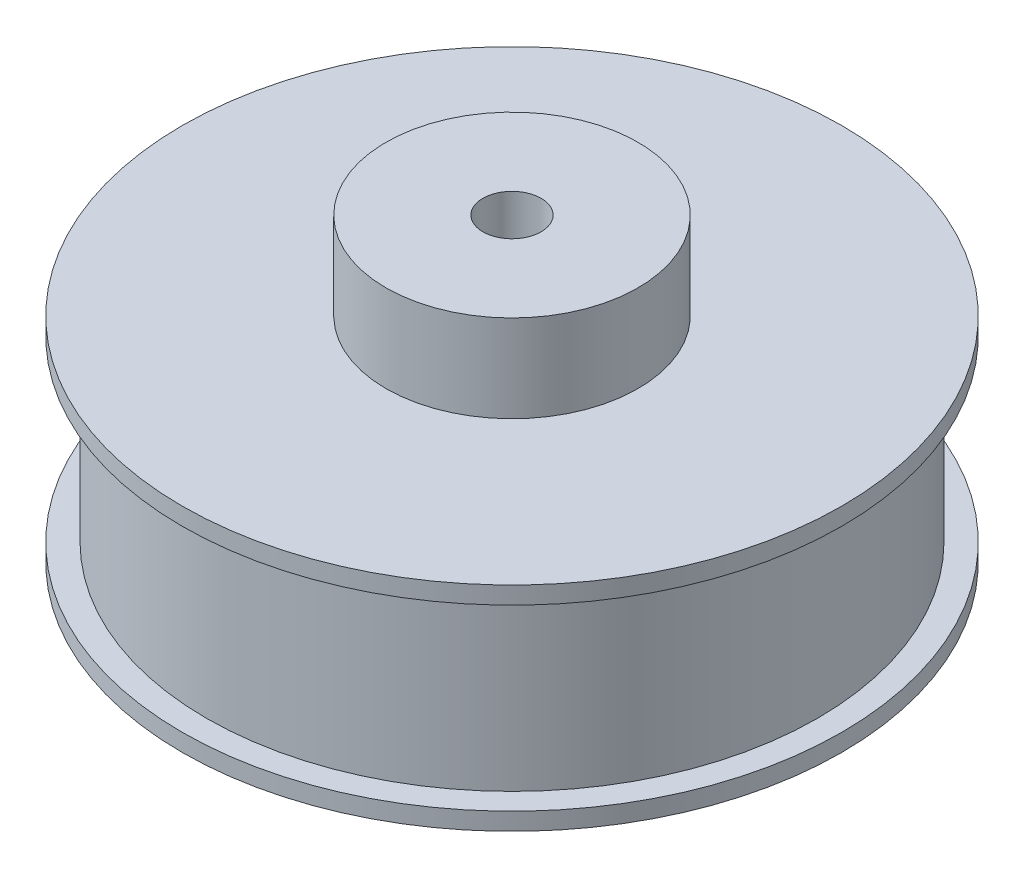
ISO-10303-21;
HEADER;
FILE_DESCRIPTION(('STEP AP214'),'2;1');
FILE_NAME('part.step','',(''),(''),'','','');
FILE_SCHEMA(('AUTOMOTIVE_DESIGN { 1 0 10303 214 1 1 1 1 }'));
ENDSEC;
DATA;
#1=APPLICATION_CONTEXT('core data for automotive mechanical design processes');
#2=APPLICATION_PROTOCOL_DEFINITION('international standard','automotive_design',2000,#1);
#3=PRODUCT_CONTEXT('',#1,'mechanical');
#4=PRODUCT('Part','Part','',(#3));
#5=PRODUCT_RELATED_PRODUCT_CATEGORY('part','',(#4));
#6=PRODUCT_DEFINITION_FORMATION('','',#4);
#7=PRODUCT_DEFINITION_CONTEXT('part definition',#1,'design');
#8=PRODUCT_DEFINITION('design','',#6,#7);
#9=PRODUCT_DEFINITION_SHAPE('','',#8);
#10=(LENGTH_UNIT() NAMED_UNIT(*) SI_UNIT(.MILLI.,.METRE.));
#11=(NAMED_UNIT(*) PLANE_ANGLE_UNIT() SI_UNIT($,.RADIAN.));
#12=(NAMED_UNIT(*) SI_UNIT($,.STERADIAN.) SOLID_ANGLE_UNIT());
#13=UNCERTAINTY_MEASURE_WITH_UNIT(LENGTH_MEASURE(1.E-05),#10,'distance_accuracy_value','');
#14=(GEOMETRIC_REPRESENTATION_CONTEXT(3) GLOBAL_UNCERTAINTY_ASSIGNED_CONTEXT((#13)) GLOBAL_UNIT_ASSIGNED_CONTEXT((#10,
#11,#12)) REPRESENTATION_CONTEXT('',''));
#15=CARTESIAN_POINT('',(0.,0.,0.));
#16=DIRECTION('',(0.,0.,1.));
#17=DIRECTION('',(1.,0.,0.));
#18=AXIS2_PLACEMENT_3D('',#15,#16,#17);
#19=CARTESIAN_POINT('',(0.,51.1748241374195,0.));
#20=DIRECTION('',(0.,1.,0.));
#21=DIRECTION('',(0.,0.,1.));
#22=AXIS2_PLACEMENT_3D('',#19,#20,#21);
#23=CYLINDRICAL_SURFACE('',#22,3.);
#24=CARTESIAN_POINT('',(0.,0.,0.));
#25=DIRECTION('',(0.,1.,0.));
#26=DIRECTION('',(0.,0.,1.));
#27=AXIS2_PLACEMENT_3D('',#24,#25,#26);
#28=CIRCLE('',#27,3.);
#29=CARTESIAN_POINT('',(0.,0.,3.));
#30=VERTEX_POINT('',#29);
#31=EDGE_CURVE('E67',#30,#30,#28,.T.);
#32=ORIENTED_EDGE('',*,*,#31,.F.);
#33=EDGE_LOOP('',(#32));
#34=FACE_BOUND('',#33,.T.);
#35=CARTESIAN_POINT('',(0.,31.,0.));
#36=DIRECTION('',(0.,1.,0.));
#37=DIRECTION('',(0.,0.,1.));
#38=AXIS2_PLACEMENT_3D('',#35,#36,#37);
#39=CIRCLE('',#38,3.00000000000001);
#40=CARTESIAN_POINT('',(0.,31.,3.00000000000001));
#41=VERTEX_POINT('',#40);
#42=EDGE_CURVE('E10',#41,#41,#39,.T.);
#43=ORIENTED_EDGE('',*,*,#42,.T.);
#44=EDGE_LOOP('',(#43));
#45=FACE_BOUND('',#44,.T.);
#46=ADVANCED_FACE('F33',(#34,#45),#23,.F.);
#47=CARTESIAN_POINT('',(3.00000000000001,31.,0.));
#48=DIRECTION('',(0.,-1.,0.));
#49=DIRECTION('',(0.,0.,-1.));
#50=AXIS2_PLACEMENT_3D('',#47,#48,#49);
#51=PLANE('',#50);
#52=ORIENTED_EDGE('',*,*,#42,.F.);
#53=EDGE_LOOP('',(#52));
#54=FACE_BOUND('',#53,.T.);
#55=CARTESIAN_POINT('',(0.,31.,0.));
#56=DIRECTION('',(0.,1.,0.));
#57=DIRECTION('',(0.,0.,1.));
#58=AXIS2_PLACEMENT_3D('',#55,#56,#57);
#59=CIRCLE('',#58,13.);
#60=CARTESIAN_POINT('',(0.,31.,13.));
#61=VERTEX_POINT('',#60);
#62=EDGE_CURVE('E39',#61,#61,#59,.T.);
#63=ORIENTED_EDGE('',*,*,#62,.T.);
#64=EDGE_LOOP('',(#63));
#65=FACE_BOUND('',#64,.T.);
#66=ADVANCED_FACE('F74',(#54,#65),#51,.F.);
#67=CARTESIAN_POINT('',(0.,51.1748241374195,0.));
#68=DIRECTION('',(0.,1.,0.));
#69=DIRECTION('',(0.,0.,1.));
#70=AXIS2_PLACEMENT_3D('',#67,#68,#69);
#71=CYLINDRICAL_SURFACE('',#70,13.);
#72=ORIENTED_EDGE('',*,*,#62,.F.);
#73=EDGE_LOOP('',(#72));
#74=FACE_BOUND('',#73,.T.);
#75=CARTESIAN_POINT('',(0.,22.,0.));
#76=DIRECTION('',(0.,1.,0.));
#77=DIRECTION('',(0.,0.,1.));
#78=AXIS2_PLACEMENT_3D('',#75,#76,#77);
#79=CIRCLE('',#78,13.);
#80=CARTESIAN_POINT('',(0.,22.,13.));
#81=VERTEX_POINT('',#80);
#82=EDGE_CURVE('E43',#81,#81,#79,.T.);
#83=ORIENTED_EDGE('',*,*,#82,.T.);
#84=EDGE_LOOP('',(#83));
#85=FACE_BOUND('',#84,.T.);
#86=ADVANCED_FACE('F78',(#74,#85),#71,.T.);
#87=CARTESIAN_POINT('',(13.,22.,0.));
#88=DIRECTION('',(0.,-1.,0.));
#89=DIRECTION('',(0.,0.,-1.));
#90=AXIS2_PLACEMENT_3D('',#87,#88,#89);
#91=PLANE('',#90);
#92=ORIENTED_EDGE('',*,*,#82,.F.);
#93=EDGE_LOOP('',(#92));
#94=FACE_BOUND('',#93,.T.);
#95=CARTESIAN_POINT('',(0.,22.,0.));
#96=DIRECTION('',(0.,1.,0.));
#97=DIRECTION('',(0.,0.,1.));
#98=AXIS2_PLACEMENT_3D('',#95,#96,#97);
#99=CIRCLE('',#98,34.);
#100=CARTESIAN_POINT('',(0.,22.,34.));
#101=VERTEX_POINT('',#100);
#102=EDGE_CURVE('E47',#101,#101,#99,.T.);
#103=ORIENTED_EDGE('',*,*,#102,.T.);
#104=EDGE_LOOP('',(#103));
#105=FACE_BOUND('',#104,.T.);
#106=ADVANCED_FACE('F83',(#94,#105),#91,.F.);
#107=CARTESIAN_POINT('',(0.,51.1748241374195,0.));
#108=DIRECTION('',(0.,1.,0.));
#109=DIRECTION('',(0.,0.,1.));
#110=AXIS2_PLACEMENT_3D('',#107,#108,#109);
#111=CYLINDRICAL_SURFACE('',#110,34.);
#112=ORIENTED_EDGE('',*,*,#102,.F.);
#113=EDGE_LOOP('',(#112));
#114=FACE_BOUND('',#113,.T.);
#115=CARTESIAN_POINT('',(0.,20.2,0.));
#116=DIRECTION('',(0.,1.,0.));
#117=DIRECTION('',(0.,0.,1.));
#118=AXIS2_PLACEMENT_3D('',#115,#116,#117);
#119=CIRCLE('',#118,34.);
#120=CARTESIAN_POINT('',(0.,20.2,34.));
#121=VERTEX_POINT('',#120);
#122=EDGE_CURVE('E52',#121,#121,#119,.T.);
#123=ORIENTED_EDGE('',*,*,#122,.T.);
#124=EDGE_LOOP('',(#123));
#125=FACE_BOUND('',#124,.T.);
#126=ADVANCED_FACE('F89',(#114,#125),#111,.T.);
#127=CARTESIAN_POINT('',(34.,20.2,0.));
#128=DIRECTION('',(0.,1.,0.));
#129=DIRECTION('',(0.,0.,1.));
#130=AXIS2_PLACEMENT_3D('',#127,#128,#129);
#131=PLANE('',#130);
#132=ORIENTED_EDGE('',*,*,#122,.F.);
#133=EDGE_LOOP('',(#132));
#134=FACE_BOUND('',#133,.T.);
#135=CARTESIAN_POINT('',(0.,20.2,0.));
#136=DIRECTION('',(0.,1.,0.));
#137=DIRECTION('',(0.,0.,1.));
#138=AXIS2_PLACEMENT_3D('',#135,#136,#137);
#139=CIRCLE('',#138,31.5);
#140=CARTESIAN_POINT('',(0.,20.2,31.5));
#141=VERTEX_POINT('',#140);
#142=EDGE_CURVE('E55',#141,#141,#139,.T.);
#143=ORIENTED_EDGE('',*,*,#142,.T.);
#144=EDGE_LOOP('',(#143));
#145=FACE_BOUND('',#144,.T.);
#146=ADVANCED_FACE('F93',(#134,#145),#131,.F.);
#147=CARTESIAN_POINT('',(0.,51.1748241374195,0.));
#148=DIRECTION('',(0.,1.,0.));
#149=DIRECTION('',(0.,0.,1.));
#150=AXIS2_PLACEMENT_3D('',#147,#148,#149);
#151=CYLINDRICAL_SURFACE('',#150,31.5);
#152=ORIENTED_EDGE('',*,*,#142,.F.);
#153=EDGE_LOOP('',(#152));
#154=FACE_BOUND('',#153,.T.);
#155=CARTESIAN_POINT('',(0.,1.8,0.));
#156=DIRECTION('',(0.,1.,0.));
#157=DIRECTION('',(0.,0.,1.));
#158=AXIS2_PLACEMENT_3D('',#155,#156,#157);
#159=CIRCLE('',#158,31.5);
#160=CARTESIAN_POINT('',(0.,1.8,31.5));
#161=VERTEX_POINT('',#160);
#162=EDGE_CURVE('E58',#161,#161,#159,.T.);
#163=ORIENTED_EDGE('',*,*,#162,.T.);
#164=EDGE_LOOP('',(#163));
#165=FACE_BOUND('',#164,.T.);
#166=ADVANCED_FACE('F97',(#154,#165),#151,.T.);
#167=CARTESIAN_POINT('',(31.5,1.8,0.));
#168=DIRECTION('',(0.,-1.,0.));
#169=DIRECTION('',(0.,0.,-1.));
#170=AXIS2_PLACEMENT_3D('',#167,#168,#169);
#171=PLANE('',#170);
#172=ORIENTED_EDGE('',*,*,#162,.F.);
#173=EDGE_LOOP('',(#172));
#174=FACE_BOUND('',#173,.T.);
#175=CARTESIAN_POINT('',(0.,1.8,0.));
#176=DIRECTION('',(0.,1.,0.));
#177=DIRECTION('',(0.,0.,1.));
#178=AXIS2_PLACEMENT_3D('',#175,#176,#177);
#179=CIRCLE('',#178,34.);
#180=CARTESIAN_POINT('',(0.,1.8,34.));
#181=VERTEX_POINT('',#180);
#182=EDGE_CURVE('E61',#181,#181,#179,.T.);
#183=ORIENTED_EDGE('',*,*,#182,.T.);
#184=EDGE_LOOP('',(#183));
#185=FACE_BOUND('',#184,.T.);
#186=ADVANCED_FACE('F101',(#174,#185),#171,.F.);
#187=CARTESIAN_POINT('',(0.,51.1748241374195,0.));
#188=DIRECTION('',(0.,1.,0.));
#189=DIRECTION('',(0.,0.,1.));
#190=AXIS2_PLACEMENT_3D('',#187,#188,#189);
#191=CYLINDRICAL_SURFACE('',#190,34.);
#192=ORIENTED_EDGE('',*,*,#182,.F.);
#193=EDGE_LOOP('',(#192));
#194=FACE_BOUND('',#193,.T.);
#195=CARTESIAN_POINT('',(0.,0.,0.));
#196=DIRECTION('',(0.,1.,0.));
#197=DIRECTION('',(0.,0.,1.));
#198=AXIS2_PLACEMENT_3D('',#195,#196,#197);
#199=CIRCLE('',#198,34.);
#200=CARTESIAN_POINT('',(0.,0.,34.));
#201=VERTEX_POINT('',#200);
#202=EDGE_CURVE('E64',#201,#201,#199,.T.);
#203=ORIENTED_EDGE('',*,*,#202,.T.);
#204=EDGE_LOOP('',(#203));
#205=FACE_BOUND('',#204,.T.);
#206=ADVANCED_FACE('F105',(#194,#205),#191,.T.);
#207=CARTESIAN_POINT('',(34.,0.,0.));
#208=DIRECTION('',(0.,1.,0.));
#209=DIRECTION('',(0.,0.,1.));
#210=AXIS2_PLACEMENT_3D('',#207,#208,#209);
#211=PLANE('',#210);
#212=ORIENTED_EDGE('',*,*,#202,.F.);
#213=EDGE_LOOP('',(#212));
#214=FACE_BOUND('',#213,.T.);
#215=ORIENTED_EDGE('',*,*,#31,.T.);
#216=EDGE_LOOP('',(#215));
#217=FACE_BOUND('',#216,.T.);
#218=ADVANCED_FACE('F71',(#214,#217),#211,.F.);
#219=CLOSED_SHELL('',(#46,#66,#86,#106,#126,#146,#166,#186,#206,#218));
#220=MANIFOLD_SOLID_BREP('B2',#219);
#221=ADVANCED_BREP_SHAPE_REPRESENTATION('',(#18,#220),#14);
#222=SHAPE_DEFINITION_REPRESENTATION(#9,#221);
ENDSEC;
END-ISO-10303-21;
